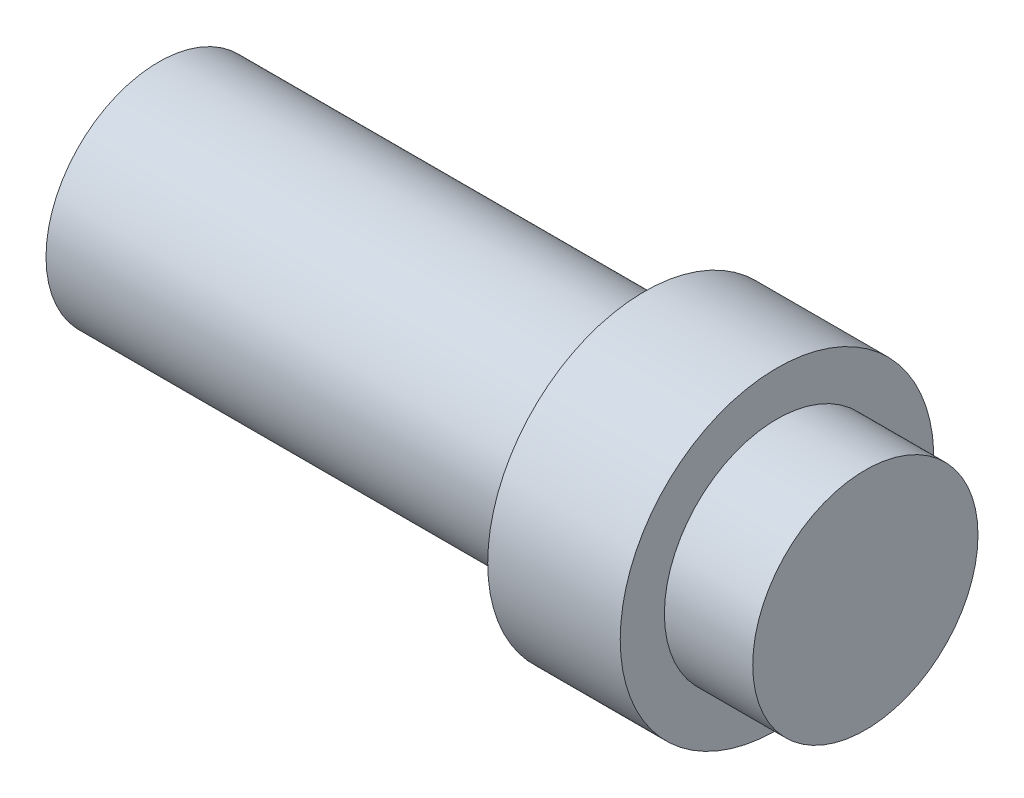
ISO-10303-21;
HEADER;
FILE_DESCRIPTION(('STEP AP214'),'2;1');
FILE_NAME('part.step','',(''),(''),'','','');
FILE_SCHEMA(('AUTOMOTIVE_DESIGN { 1 0 10303 214 1 1 1 1 }'));
ENDSEC;
DATA;
#1=APPLICATION_CONTEXT('core data for automotive mechanical design processes');
#2=APPLICATION_PROTOCOL_DEFINITION('international standard','automotive_design',2000,#1);
#3=PRODUCT_CONTEXT('',#1,'mechanical');
#4=PRODUCT('Part','Part','',(#3));
#5=PRODUCT_RELATED_PRODUCT_CATEGORY('part','',(#4));
#6=PRODUCT_DEFINITION_FORMATION('','',#4);
#7=PRODUCT_DEFINITION_CONTEXT('part definition',#1,'design');
#8=PRODUCT_DEFINITION('design','',#6,#7);
#9=PRODUCT_DEFINITION_SHAPE('','',#8);
#10=(LENGTH_UNIT() NAMED_UNIT(*) SI_UNIT(.MILLI.,.METRE.));
#11=(NAMED_UNIT(*) PLANE_ANGLE_UNIT() SI_UNIT($,.RADIAN.));
#12=(NAMED_UNIT(*) SI_UNIT($,.STERADIAN.) SOLID_ANGLE_UNIT());
#13=UNCERTAINTY_MEASURE_WITH_UNIT(LENGTH_MEASURE(1.E-05),#10,'distance_accuracy_value','');
#14=(GEOMETRIC_REPRESENTATION_CONTEXT(3) GLOBAL_UNCERTAINTY_ASSIGNED_CONTEXT((#13)) GLOBAL_UNIT_ASSIGNED_CONTEXT((#10,
#11,#12)) REPRESENTATION_CONTEXT('',''));
#15=CARTESIAN_POINT('',(0.,0.,0.));
#16=DIRECTION('',(0.,0.,1.));
#17=DIRECTION('',(1.,0.,0.));
#18=AXIS2_PLACEMENT_3D('',#15,#16,#17);
#19=CARTESIAN_POINT('',(-25.,0.,0.));
#20=DIRECTION('',(1.,0.,0.));
#21=DIRECTION('',(0.,0.,-1.));
#22=AXIS2_PLACEMENT_3D('',#19,#20,#21);
#23=PLANE('',#22);
#24=CARTESIAN_POINT('',(-25.,0.,0.));
#25=DIRECTION('',(-1.,0.,0.));
#26=DIRECTION('',(0.,0.,1.));
#27=AXIS2_PLACEMENT_3D('',#24,#25,#26);
#28=CIRCLE('',#27,5.1);
#29=CARTESIAN_POINT('',(-25.,0.,5.1));
#30=VERTEX_POINT('',#29);
#31=EDGE_CURVE('E10',#30,#30,#28,.T.);
#32=ORIENTED_EDGE('',*,*,#31,.T.);
#33=EDGE_LOOP('',(#32));
#34=FACE_BOUND('',#33,.T.);
#35=ADVANCED_FACE('F32',(#34),#23,.F.);
#36=CARTESIAN_POINT('',(-84.7959840628671,0.,0.));
#37=DIRECTION('',(-1.,0.,0.));
#38=DIRECTION('',(0.,0.,1.));
#39=AXIS2_PLACEMENT_3D('',#36,#37,#38);
#40=CYLINDRICAL_SURFACE('',#39,5.1);
#41=ORIENTED_EDGE('',*,*,#31,.F.);
#42=EDGE_LOOP('',(#41));
#43=FACE_BOUND('',#42,.T.);
#44=CARTESIAN_POINT('',(-2.99999999999999,0.,0.));
#45=DIRECTION('',(-1.,0.,0.));
#46=DIRECTION('',(0.,0.,1.));
#47=AXIS2_PLACEMENT_3D('',#44,#45,#46);
#48=CIRCLE('',#47,5.1);
#49=CARTESIAN_POINT('',(-2.99999999999999,0.,5.1));
#50=VERTEX_POINT('',#49);
#51=EDGE_CURVE('E38',#50,#50,#48,.T.);
#52=ORIENTED_EDGE('',*,*,#51,.T.);
#53=EDGE_LOOP('',(#52));
#54=FACE_BOUND('',#53,.T.);
#55=ADVANCED_FACE('F70',(#43,#54),#40,.T.);
#56=CARTESIAN_POINT('',(-2.99999999999999,5.1,0.));
#57=DIRECTION('',(1.,0.,0.));
#58=DIRECTION('',(0.,0.,-1.));
#59=AXIS2_PLACEMENT_3D('',#56,#57,#58);
#60=PLANE('',#59);
#61=ORIENTED_EDGE('',*,*,#51,.F.);
#62=EDGE_LOOP('',(#61));
#63=FACE_BOUND('',#62,.T.);
#64=CARTESIAN_POINT('',(-2.99999999999999,0.,0.));
#65=DIRECTION('',(-1.,0.,0.));
#66=DIRECTION('',(0.,0.,1.));
#67=AXIS2_PLACEMENT_3D('',#64,#65,#66);
#68=CIRCLE('',#67,7.1);
#69=CARTESIAN_POINT('',(-2.99999999999999,0.,7.1));
#70=VERTEX_POINT('',#69);
#71=EDGE_CURVE('E42',#70,#70,#68,.T.);
#72=ORIENTED_EDGE('',*,*,#71,.T.);
#73=EDGE_LOOP('',(#72));
#74=FACE_BOUND('',#73,.T.);
#75=ADVANCED_FACE('F74',(#63,#74),#60,.F.);
#76=CARTESIAN_POINT('',(-84.7959840628671,0.,0.));
#77=DIRECTION('',(-1.,0.,0.));
#78=DIRECTION('',(0.,0.,1.));
#79=AXIS2_PLACEMENT_3D('',#76,#77,#78);
#80=CYLINDRICAL_SURFACE('',#79,7.1);
#81=ORIENTED_EDGE('',*,*,#71,.F.);
#82=EDGE_LOOP('',(#81));
#83=FACE_BOUND('',#82,.T.);
#84=CARTESIAN_POINT('',(3.,0.,0.));
#85=DIRECTION('',(-1.,0.,0.));
#86=DIRECTION('',(0.,0.,1.));
#87=AXIS2_PLACEMENT_3D('',#84,#85,#86);
#88=CIRCLE('',#87,7.1);
#89=CARTESIAN_POINT('',(3.,0.,7.1));
#90=VERTEX_POINT('',#89);
#91=EDGE_CURVE('E46',#90,#90,#88,.T.);
#92=ORIENTED_EDGE('',*,*,#91,.T.);
#93=EDGE_LOOP('',(#92));
#94=FACE_BOUND('',#93,.T.);
#95=ADVANCED_FACE('F79',(#83,#94),#80,.T.);
#96=CARTESIAN_POINT('',(3.00000000000001,7.1,0.));
#97=DIRECTION('',(-1.,0.,0.));
#98=DIRECTION('',(0.,0.,1.));
#99=AXIS2_PLACEMENT_3D('',#96,#97,#98);
#100=PLANE('',#99);
#101=ORIENTED_EDGE('',*,*,#91,.F.);
#102=EDGE_LOOP('',(#101));
#103=FACE_BOUND('',#102,.T.);
#104=CARTESIAN_POINT('',(3.,0.,0.));
#105=DIRECTION('',(-1.,0.,0.));
#106=DIRECTION('',(0.,0.,1.));
#107=AXIS2_PLACEMENT_3D('',#104,#105,#106);
#108=CIRCLE('',#107,5.1);
#109=CARTESIAN_POINT('',(3.,0.,5.1));
#110=VERTEX_POINT('',#109);
#111=EDGE_CURVE('E51',#110,#110,#108,.T.);
#112=ORIENTED_EDGE('',*,*,#111,.T.);
#113=EDGE_LOOP('',(#112));
#114=FACE_BOUND('',#113,.T.);
#115=ADVANCED_FACE('F66',(#103,#114),#100,.F.);
#116=CARTESIAN_POINT('',(-84.7959840628671,0.,0.));
#117=DIRECTION('',(-1.,0.,0.));
#118=DIRECTION('',(0.,0.,1.));
#119=AXIS2_PLACEMENT_3D('',#116,#117,#118);
#120=CYLINDRICAL_SURFACE('',#119,5.1);
#121=ORIENTED_EDGE('',*,*,#111,.F.);
#122=EDGE_LOOP('',(#121));
#123=FACE_BOUND('',#122,.T.);
#124=CARTESIAN_POINT('',(7.00000000000001,0.,0.));
#125=DIRECTION('',(-1.,0.,0.));
#126=DIRECTION('',(0.,0.,1.));
#127=AXIS2_PLACEMENT_3D('',#124,#125,#126);
#128=CIRCLE('',#127,5.1);
#129=CARTESIAN_POINT('',(7.00000000000001,0.,5.1));
#130=VERTEX_POINT('',#129);
#131=EDGE_CURVE('E54',#130,#130,#128,.T.);
#132=ORIENTED_EDGE('',*,*,#131,.T.);
#133=EDGE_LOOP('',(#132));
#134=FACE_BOUND('',#133,.T.);
#135=ADVANCED_FACE('F58',(#123,#134),#120,.T.);
#136=CARTESIAN_POINT('',(7.00000000000001,5.1,0.));
#137=DIRECTION('',(-1.,0.,0.));
#138=DIRECTION('',(0.,0.,1.));
#139=AXIS2_PLACEMENT_3D('',#136,#137,#138);
#140=PLANE('',#139);
#141=ORIENTED_EDGE('',*,*,#131,.F.);
#142=EDGE_LOOP('',(#141));
#143=FACE_BOUND('',#142,.T.);
#144=ADVANCED_FACE('F60',(#143),#140,.F.);
#145=CLOSED_SHELL('',(#35,#55,#75,#95,#115,#135,#144));
#146=MANIFOLD_SOLID_BREP('B2',#145);
#147=ADVANCED_BREP_SHAPE_REPRESENTATION('',(#18,#146),#14);
#148=SHAPE_DEFINITION_REPRESENTATION(#9,#147);
ENDSEC;
END-ISO-10303-21;
